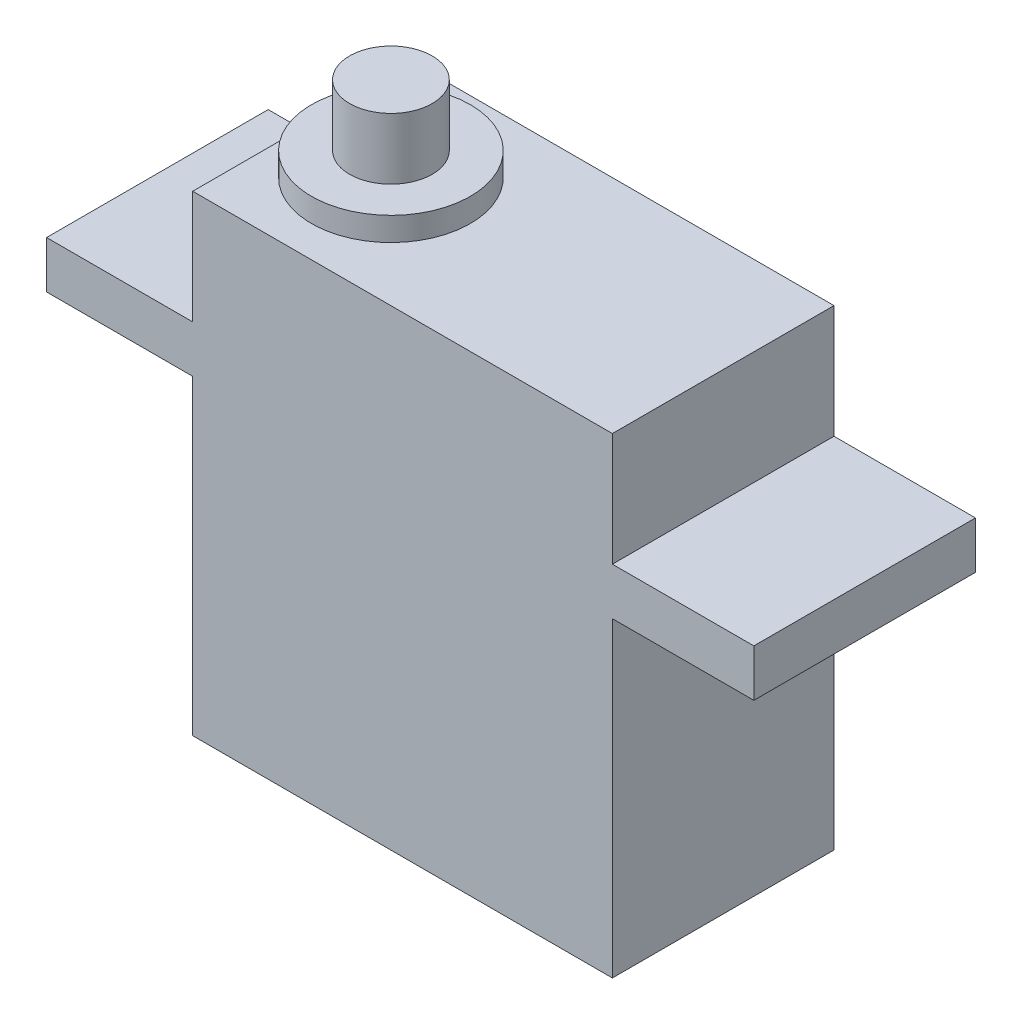
ISO-10303-21;
HEADER;
FILE_DESCRIPTION(('STEP AP214'),'2;1');
FILE_NAME('part.step','',(''),(''),'','','');
FILE_SCHEMA(('AUTOMOTIVE_DESIGN { 1 0 10303 214 1 1 1 1 }'));
ENDSEC;
DATA;
#1=APPLICATION_CONTEXT('core data for automotive mechanical design processes');
#2=APPLICATION_PROTOCOL_DEFINITION('international standard','automotive_design',2000,#1);
#3=PRODUCT_CONTEXT('',#1,'mechanical');
#4=PRODUCT('Part','Part','',(#3));
#5=PRODUCT_RELATED_PRODUCT_CATEGORY('part','',(#4));
#6=PRODUCT_DEFINITION_FORMATION('','',#4);
#7=PRODUCT_DEFINITION_CONTEXT('part definition',#1,'design');
#8=PRODUCT_DEFINITION('design','',#6,#7);
#9=PRODUCT_DEFINITION_SHAPE('','',#8);
#10=(LENGTH_UNIT() NAMED_UNIT(*) SI_UNIT(.MILLI.,.METRE.));
#11=(NAMED_UNIT(*) PLANE_ANGLE_UNIT() SI_UNIT($,.RADIAN.));
#12=(NAMED_UNIT(*) SI_UNIT($,.STERADIAN.) SOLID_ANGLE_UNIT());
#13=UNCERTAINTY_MEASURE_WITH_UNIT(LENGTH_MEASURE(1.E-05),#10,'distance_accuracy_value','');
#14=(GEOMETRIC_REPRESENTATION_CONTEXT(3) GLOBAL_UNCERTAINTY_ASSIGNED_CONTEXT((#13)) GLOBAL_UNIT_ASSIGNED_CONTEXT((#10,
#11,#12)) REPRESENTATION_CONTEXT('',''));
#15=CARTESIAN_POINT('',(0.,0.,0.));
#16=DIRECTION('',(0.,0.,1.));
#17=DIRECTION('',(1.,0.,0.));
#18=AXIS2_PLACEMENT_3D('',#15,#16,#17);
#19=CARTESIAN_POINT('',(0.,25.4,0.));
#20=DIRECTION('',(1.,0.,0.));
#21=DIRECTION('',(0.,0.,-1.));
#22=AXIS2_PLACEMENT_3D('',#19,#20,#21);
#23=PLANE('',#22);
#24=DIRECTION('',(0.,-1.,0.));
#25=VECTOR('',#24,1.);
#26=CARTESIAN_POINT('',(0.,25.4,-11.938));
#27=LINE('',#26,#25);
#28=CARTESIAN_POINT('',(0.,25.4,-11.938));
#29=VERTEX_POINT('',#28);
#30=CARTESIAN_POINT('',(0.,19.304,-11.938));
#31=VERTEX_POINT('',#30);
#32=EDGE_CURVE('E246',#29,#31,#27,.T.);
#33=ORIENTED_EDGE('',*,*,#32,.T.);
#34=DIRECTION('',(0.,0.,1.));
#35=VECTOR('',#34,1.);
#36=CARTESIAN_POINT('',(0.,19.304,0.));
#37=LINE('',#36,#35);
#38=CARTESIAN_POINT('',(0.,19.304,0.));
#39=VERTEX_POINT('',#38);
#40=EDGE_CURVE('E204',#31,#39,#37,.T.);
#41=ORIENTED_EDGE('',*,*,#40,.T.);
#42=DIRECTION('',(0.,-1.,0.));
#43=VECTOR('',#42,1.);
#44=CARTESIAN_POINT('',(0.,25.4,0.));
#45=LINE('',#44,#43);
#46=CARTESIAN_POINT('',(0.,25.4,0.));
#47=VERTEX_POINT('',#46);
#48=EDGE_CURVE('E54',#47,#39,#45,.T.);
#49=ORIENTED_EDGE('',*,*,#48,.F.);
#50=DIRECTION('',(0.,0.,1.));
#51=VECTOR('',#50,1.);
#52=CARTESIAN_POINT('',(0.,25.4,0.));
#53=LINE('',#52,#51);
#54=EDGE_CURVE('E218',#29,#47,#53,.T.);
#55=ORIENTED_EDGE('',*,*,#54,.F.);
#56=EDGE_LOOP('',(#33,#41,#49,#55));
#57=FACE_BOUND('',#56,.T.);
#58=ADVANCED_FACE('F45',(#57),#23,.F.);
#59=CARTESIAN_POINT('',(22.606,25.4,0.));
#60=DIRECTION('',(-1.,0.,0.));
#61=DIRECTION('',(0.,0.,1.));
#62=AXIS2_PLACEMENT_3D('',#59,#60,#61);
#63=PLANE('',#62);
#64=DIRECTION('',(0.,-1.,0.));
#65=VECTOR('',#64,1.);
#66=CARTESIAN_POINT('',(22.606,25.4,0.));
#67=LINE('',#66,#65);
#68=CARTESIAN_POINT('',(22.606,25.4,0.));
#69=VERTEX_POINT('',#68);
#70=CARTESIAN_POINT('',(22.606,19.304,0.));
#71=VERTEX_POINT('',#70);
#72=EDGE_CURVE('E255',#69,#71,#67,.T.);
#73=ORIENTED_EDGE('',*,*,#72,.T.);
#74=DIRECTION('',(0.,0.,-1.));
#75=VECTOR('',#74,1.);
#76=CARTESIAN_POINT('',(22.606,19.304,0.));
#77=LINE('',#76,#75);
#78=CARTESIAN_POINT('',(22.606,19.304,-11.938));
#79=VERTEX_POINT('',#78);
#80=EDGE_CURVE('E200',#71,#79,#77,.T.);
#81=ORIENTED_EDGE('',*,*,#80,.T.);
#82=DIRECTION('',(0.,-1.,0.));
#83=VECTOR('',#82,1.);
#84=CARTESIAN_POINT('',(22.606,25.4,-11.938));
#85=LINE('',#84,#83);
#86=CARTESIAN_POINT('',(22.606,25.4,-11.938));
#87=VERTEX_POINT('',#86);
#88=EDGE_CURVE('E251',#87,#79,#85,.T.);
#89=ORIENTED_EDGE('',*,*,#88,.F.);
#90=DIRECTION('',(0.,0.,-1.));
#91=VECTOR('',#90,1.);
#92=CARTESIAN_POINT('',(22.606,25.4,0.));
#93=LINE('',#92,#91);
#94=EDGE_CURVE('E226',#69,#87,#93,.T.);
#95=ORIENTED_EDGE('',*,*,#94,.F.);
#96=EDGE_LOOP('',(#73,#81,#89,#95));
#97=FACE_BOUND('',#96,.T.);
#98=ADVANCED_FACE('F298',(#97),#63,.F.);
#99=CARTESIAN_POINT('',(0.,16.764,0.));
#100=VERTEX_POINT('',#99);
#101=CARTESIAN_POINT('',(0.,0.,0.));
#102=VERTEX_POINT('',#101);
#103=EDGE_CURVE('E259',#100,#102,#45,.T.);
#104=ORIENTED_EDGE('',*,*,#103,.F.);
#105=DIRECTION('',(0.,0.,-1.));
#106=VECTOR('',#105,1.);
#107=CARTESIAN_POINT('',(0.,16.764,0.));
#108=LINE('',#107,#106);
#109=CARTESIAN_POINT('',(0.,16.764,-11.938));
#110=VERTEX_POINT('',#109);
#111=EDGE_CURVE('E197',#100,#110,#108,.T.);
#112=ORIENTED_EDGE('',*,*,#111,.T.);
#113=CARTESIAN_POINT('',(0.,0.,-11.938));
#114=VERTEX_POINT('',#113);
#115=EDGE_CURVE('E232',#110,#114,#27,.T.);
#116=ORIENTED_EDGE('',*,*,#115,.T.);
#117=DIRECTION('',(0.,0.,1.));
#118=VECTOR('',#117,1.);
#119=CARTESIAN_POINT('',(0.,0.,0.));
#120=LINE('',#119,#118);
#121=EDGE_CURVE('E217',#114,#102,#120,.T.);
#122=ORIENTED_EDGE('',*,*,#121,.T.);
#123=EDGE_LOOP('',(#104,#112,#116,#122));
#124=FACE_BOUND('',#123,.T.);
#125=ADVANCED_FACE('F47',(#124),#23,.F.);
#126=CARTESIAN_POINT('',(0.,25.4,0.));
#127=DIRECTION('',(0.,0.,-1.));
#128=DIRECTION('',(-1.,0.,0.));
#129=AXIS2_PLACEMENT_3D('',#126,#127,#128);
#130=PLANE('',#129);
#131=CARTESIAN_POINT('',(22.606,16.764,0.));
#132=VERTEX_POINT('',#131);
#133=CARTESIAN_POINT('',(22.606,0.,0.));
#134=VERTEX_POINT('',#133);
#135=EDGE_CURVE('E140',#132,#134,#67,.T.);
#136=ORIENTED_EDGE('',*,*,#135,.F.);
#137=DIRECTION('',(1.,0.,0.));
#138=VECTOR('',#137,1.);
#139=CARTESIAN_POINT('',(-7.874,16.764,0.));
#140=LINE('',#139,#138);
#141=CARTESIAN_POINT('',(30.226,16.764,0.));
#142=VERTEX_POINT('',#141);
#143=EDGE_CURVE('E61',#132,#142,#140,.T.);
#144=ORIENTED_EDGE('',*,*,#143,.T.);
#145=DIRECTION('',(0.,-1.,0.));
#146=VECTOR('',#145,1.);
#147=CARTESIAN_POINT('',(30.226,19.304,0.));
#148=LINE('',#147,#146);
#149=CARTESIAN_POINT('',(30.226,19.304,0.));
#150=VERTEX_POINT('',#149);
#151=EDGE_CURVE('E138',#150,#142,#148,.T.);
#152=ORIENTED_EDGE('',*,*,#151,.F.);
#153=DIRECTION('',(1.,0.,0.));
#154=VECTOR('',#153,1.);
#155=CARTESIAN_POINT('',(-7.874,19.304,0.));
#156=LINE('',#155,#154);
#157=EDGE_CURVE('E185',#71,#150,#156,.T.);
#158=ORIENTED_EDGE('',*,*,#157,.F.);
#159=ORIENTED_EDGE('',*,*,#72,.F.);
#160=DIRECTION('',(1.,0.,0.));
#161=VECTOR('',#160,1.);
#162=CARTESIAN_POINT('',(0.,25.4,0.));
#163=LINE('',#162,#161);
#164=EDGE_CURVE('E222',#47,#69,#163,.T.);
#165=ORIENTED_EDGE('',*,*,#164,.F.);
#166=ORIENTED_EDGE('',*,*,#48,.T.);
#167=CARTESIAN_POINT('',(-7.874,19.304,0.));
#168=VERTEX_POINT('',#167);
#169=EDGE_CURVE('E181',#168,#39,#156,.T.);
#170=ORIENTED_EDGE('',*,*,#169,.F.);
#171=DIRECTION('',(0.,-1.,0.));
#172=VECTOR('',#171,1.);
#173=CARTESIAN_POINT('',(-7.874,19.304,0.));
#174=LINE('',#173,#172);
#175=CARTESIAN_POINT('',(-7.874,16.764,0.));
#176=VERTEX_POINT('',#175);
#177=EDGE_CURVE('E167',#168,#176,#174,.T.);
#178=ORIENTED_EDGE('',*,*,#177,.T.);
#179=EDGE_CURVE('E142',#176,#100,#140,.T.);
#180=ORIENTED_EDGE('',*,*,#179,.T.);
#181=ORIENTED_EDGE('',*,*,#103,.T.);
#182=DIRECTION('',(1.,0.,0.));
#183=VECTOR('',#182,1.);
#184=CARTESIAN_POINT('',(0.,0.,0.));
#185=LINE('',#184,#183);
#186=EDGE_CURVE('E236',#102,#134,#185,.T.);
#187=ORIENTED_EDGE('',*,*,#186,.T.);
#188=EDGE_LOOP('',(#136,#144,#152,#158,#159,#165,#166,#170,#178,#180,#181,#187));
#189=FACE_BOUND('',#188,.T.);
#190=ADVANCED_FACE('F135',(#189),#130,.F.);
#191=CARTESIAN_POINT('',(22.606,16.764,-11.938));
#192=VERTEX_POINT('',#191);
#193=CARTESIAN_POINT('',(22.606,0.,-11.938));
#194=VERTEX_POINT('',#193);
#195=EDGE_CURVE('E250',#192,#194,#85,.T.);
#196=ORIENTED_EDGE('',*,*,#195,.F.);
#197=DIRECTION('',(0.,0.,1.));
#198=VECTOR('',#197,1.);
#199=CARTESIAN_POINT('',(22.606,16.764,0.));
#200=LINE('',#199,#198);
#201=EDGE_CURVE('E184',#192,#132,#200,.T.);
#202=ORIENTED_EDGE('',*,*,#201,.T.);
#203=ORIENTED_EDGE('',*,*,#135,.T.);
#204=DIRECTION('',(0.,0.,-1.));
#205=VECTOR('',#204,1.);
#206=CARTESIAN_POINT('',(22.606,0.,0.));
#207=LINE('',#206,#205);
#208=EDGE_CURVE('E239',#134,#194,#207,.T.);
#209=ORIENTED_EDGE('',*,*,#208,.T.);
#210=EDGE_LOOP('',(#196,#202,#203,#209));
#211=FACE_BOUND('',#210,.T.);
#212=ADVANCED_FACE('F321',(#211),#63,.F.);
#213=CARTESIAN_POINT('',(0.,25.4,-11.938));
#214=DIRECTION('',(0.,0.,1.));
#215=DIRECTION('',(1.,0.,0.));
#216=AXIS2_PLACEMENT_3D('',#213,#214,#215);
#217=PLANE('',#216);
#218=ORIENTED_EDGE('',*,*,#115,.F.);
#219=DIRECTION('',(1.,0.,0.));
#220=VECTOR('',#219,1.);
#221=CARTESIAN_POINT('',(-7.874,16.764,-11.938));
#222=LINE('',#221,#220);
#223=CARTESIAN_POINT('',(-7.874,16.764,-11.938));
#224=VERTEX_POINT('',#223);
#225=EDGE_CURVE('E69',#224,#110,#222,.T.);
#226=ORIENTED_EDGE('',*,*,#225,.F.);
#227=DIRECTION('',(0.,1.,0.));
#228=VECTOR('',#227,1.);
#229=CARTESIAN_POINT('',(-7.874,19.304,-11.938));
#230=LINE('',#229,#228);
#231=CARTESIAN_POINT('',(-7.874,19.304,-11.938));
#232=VERTEX_POINT('',#231);
#233=EDGE_CURVE('E174',#224,#232,#230,.T.);
#234=ORIENTED_EDGE('',*,*,#233,.T.);
#235=DIRECTION('',(1.,0.,0.));
#236=VECTOR('',#235,1.);
#237=CARTESIAN_POINT('',(-7.874,19.304,-11.938));
#238=LINE('',#237,#236);
#239=EDGE_CURVE('E186',#232,#31,#238,.T.);
#240=ORIENTED_EDGE('',*,*,#239,.T.);
#241=ORIENTED_EDGE('',*,*,#32,.F.);
#242=DIRECTION('',(-1.,0.,0.));
#243=VECTOR('',#242,1.);
#244=CARTESIAN_POINT('',(0.,25.4,-11.938));
#245=LINE('',#244,#243);
#246=EDGE_CURVE('E229',#87,#29,#245,.T.);
#247=ORIENTED_EDGE('',*,*,#246,.F.);
#248=ORIENTED_EDGE('',*,*,#88,.T.);
#249=CARTESIAN_POINT('',(30.226,19.304,-11.938));
#250=VERTEX_POINT('',#249);
#251=EDGE_CURVE('E190',#79,#250,#238,.T.);
#252=ORIENTED_EDGE('',*,*,#251,.T.);
#253=DIRECTION('',(0.,1.,0.));
#254=VECTOR('',#253,1.);
#255=CARTESIAN_POINT('',(30.226,19.304,-11.938));
#256=LINE('',#255,#254);
#257=CARTESIAN_POINT('',(30.226,16.764,-11.938));
#258=VERTEX_POINT('',#257);
#259=EDGE_CURVE('E154',#258,#250,#256,.T.);
#260=ORIENTED_EDGE('',*,*,#259,.F.);
#261=EDGE_CURVE('E149',#192,#258,#222,.T.);
#262=ORIENTED_EDGE('',*,*,#261,.F.);
#263=ORIENTED_EDGE('',*,*,#195,.T.);
#264=DIRECTION('',(-1.,0.,0.));
#265=VECTOR('',#264,1.);
#266=CARTESIAN_POINT('',(0.,0.,-11.938));
#267=LINE('',#266,#265);
#268=EDGE_CURVE('E223',#194,#114,#267,.T.);
#269=ORIENTED_EDGE('',*,*,#268,.T.);
#270=EDGE_LOOP('',(#218,#226,#234,#240,#241,#247,#248,#252,#260,#262,#263,#269));
#271=FACE_BOUND('',#270,.T.);
#272=ADVANCED_FACE('F286',(#271),#217,.F.);
#273=CARTESIAN_POINT('',(0.,25.4,0.));
#274=DIRECTION('',(0.,-1.,0.));
#275=DIRECTION('',(0.,0.,-1.));
#276=AXIS2_PLACEMENT_3D('',#273,#274,#275);
#277=PLANE('',#276);
#278=CARTESIAN_POINT('',(4.70703293865259,25.4,-5.969));
#279=DIRECTION('',(0.,-1.,0.));
#280=DIRECTION('',(0.,0.,-1.));
#281=AXIS2_PLACEMENT_3D('',#278,#279,#280);
#282=CIRCLE('',#281,4.27967995764576);
#283=CARTESIAN_POINT('',(4.70703293865259,25.4,-10.2486799576458));
#284=VERTEX_POINT('',#283);
#285=EDGE_CURVE('E11',#284,#284,#282,.F.);
#286=ORIENTED_EDGE('',*,*,#285,.F.);
#287=EDGE_LOOP('',(#286));
#288=FACE_BOUND('',#287,.T.);
#289=ORIENTED_EDGE('',*,*,#54,.T.);
#290=ORIENTED_EDGE('',*,*,#164,.T.);
#291=ORIENTED_EDGE('',*,*,#94,.T.);
#292=ORIENTED_EDGE('',*,*,#246,.T.);
#293=EDGE_LOOP('',(#289,#290,#291,#292));
#294=FACE_BOUND('',#293,.T.);
#295=ADVANCED_FACE('F283',(#288,#294),#277,.F.);
#296=CARTESIAN_POINT('',(0.,0.,0.));
#297=DIRECTION('',(0.,-1.,0.));
#298=DIRECTION('',(0.,0.,-1.));
#299=AXIS2_PLACEMENT_3D('',#296,#297,#298);
#300=PLANE('',#299);
#301=ORIENTED_EDGE('',*,*,#121,.F.);
#302=ORIENTED_EDGE('',*,*,#268,.F.);
#303=ORIENTED_EDGE('',*,*,#208,.F.);
#304=ORIENTED_EDGE('',*,*,#186,.F.);
#305=EDGE_LOOP('',(#301,#302,#303,#304));
#306=FACE_BOUND('',#305,.T.);
#307=ADVANCED_FACE('F279',(#306),#300,.T.);
#308=CARTESIAN_POINT('',(4.70703293865259,26.67,-5.969));
#309=DIRECTION('',(0.,-1.,0.));
#310=DIRECTION('',(0.,0.,-1.));
#311=AXIS2_PLACEMENT_3D('',#308,#309,#310);
#312=CYLINDRICAL_SURFACE('',#311,4.27967995764576);
#313=CARTESIAN_POINT('',(4.70703293865259,26.67,-5.969));
#314=DIRECTION('',(0.,1.,0.));
#315=DIRECTION('',(0.,0.,1.));
#316=AXIS2_PLACEMENT_3D('',#313,#314,#315);
#317=CIRCLE('',#316,4.27967995764576);
#318=CARTESIAN_POINT('',(4.70703293865259,26.67,-10.2486799576458));
#319=VERTEX_POINT('',#318);
#320=EDGE_CURVE('E208',#319,#319,#317,.T.);
#321=CARTESIAN_POINT('',(4.70703293865259,26.67,-10.2486799576458));
#322=CARTESIAN_POINT('',(4.70703293865259,26.6567708333333,-10.2486799576458));
#323=CARTESIAN_POINT('',(4.70703293865259,26.6435416666667,-10.2486799576458));
#324=CARTESIAN_POINT('',(4.70703293865259,26.6170833333333,-10.2486799576458));
#325=CARTESIAN_POINT('',(4.70703293865259,26.6038541666667,-10.2486799576458));
#326=CARTESIAN_POINT('',(4.70703293865259,26.5773958333333,-10.2486799576458));
#327=CARTESIAN_POINT('',(4.70703293865259,26.5641666666667,-10.2486799576458));
#328=CARTESIAN_POINT('',(4.70703293865259,26.5377083333333,-10.2486799576458));
#329=CARTESIAN_POINT('',(4.70703293865259,26.5244791666667,-10.2486799576458));
#330=CARTESIAN_POINT('',(4.70703293865259,26.4980208333333,-10.2486799576458));
#331=CARTESIAN_POINT('',(4.70703293865259,26.4847916666667,-10.2486799576458));
#332=CARTESIAN_POINT('',(4.70703293865259,26.4583333333333,-10.2486799576458));
#333=CARTESIAN_POINT('',(4.70703293865259,26.4451041666667,-10.2486799576458));
#334=CARTESIAN_POINT('',(4.70703293865259,26.4186458333333,-10.2486799576458));
#335=CARTESIAN_POINT('',(4.70703293865259,26.4054166666667,-10.2486799576458));
#336=CARTESIAN_POINT('',(4.70703293865259,26.3789583333333,-10.2486799576458));
#337=CARTESIAN_POINT('',(4.70703293865259,26.3657291666667,-10.2486799576458));
#338=CARTESIAN_POINT('',(4.70703293865259,26.3392708333333,-10.2486799576458));
#339=CARTESIAN_POINT('',(4.70703293865259,26.3260416666667,-10.2486799576458));
#340=CARTESIAN_POINT('',(4.70703293865259,26.2995833333333,-10.2486799576458));
#341=CARTESIAN_POINT('',(4.70703293865259,26.2863541666667,-10.2486799576458));
#342=CARTESIAN_POINT('',(4.70703293865259,26.2598958333333,-10.2486799576458));
#343=CARTESIAN_POINT('',(4.70703293865259,26.2466666666667,-10.2486799576458));
#344=CARTESIAN_POINT('',(4.70703293865259,26.2202083333333,-10.2486799576458));
#345=CARTESIAN_POINT('',(4.70703293865259,26.2069791666667,-10.2486799576458));
#346=CARTESIAN_POINT('',(4.70703293865259,26.1805208333333,-10.2486799576458));
#347=CARTESIAN_POINT('',(4.70703293865259,26.1672916666667,-10.2486799576458));
#348=CARTESIAN_POINT('',(4.70703293865259,26.1408333333333,-10.2486799576458));
#349=CARTESIAN_POINT('',(4.70703293865259,26.1276041666667,-10.2486799576458));
#350=CARTESIAN_POINT('',(4.70703293865259,26.1011458333333,-10.2486799576458));
#351=CARTESIAN_POINT('',(4.70703293865259,26.0879166666667,-10.2486799576458));
#352=CARTESIAN_POINT('',(4.70703293865259,26.0614583333333,-10.2486799576458));
#353=CARTESIAN_POINT('',(4.70703293865259,26.0482291666667,-10.2486799576458));
#354=CARTESIAN_POINT('',(4.70703293865259,26.0217708333333,-10.2486799576458));
#355=CARTESIAN_POINT('',(4.70703293865259,26.0085416666667,-10.2486799576458));
#356=CARTESIAN_POINT('',(4.70703293865259,25.9820833333333,-10.2486799576458));
#357=CARTESIAN_POINT('',(4.70703293865259,25.9688541666667,-10.2486799576458));
#358=CARTESIAN_POINT('',(4.70703293865259,25.9423958333333,-10.2486799576458));
#359=CARTESIAN_POINT('',(4.70703293865259,25.9291666666667,-10.2486799576458));
#360=CARTESIAN_POINT('',(4.70703293865259,25.9027083333333,-10.2486799576458));
#361=CARTESIAN_POINT('',(4.70703293865259,25.8894791666667,-10.2486799576458));
#362=CARTESIAN_POINT('',(4.70703293865259,25.8630208333333,-10.2486799576458));
#363=CARTESIAN_POINT('',(4.70703293865259,25.8497916666667,-10.2486799576458));
#364=CARTESIAN_POINT('',(4.70703293865259,25.8233333333333,-10.2486799576458));
#365=CARTESIAN_POINT('',(4.70703293865259,25.8101041666667,-10.2486799576458));
#366=CARTESIAN_POINT('',(4.70703293865259,25.7836458333333,-10.2486799576458));
#367=CARTESIAN_POINT('',(4.70703293865259,25.7704166666667,-10.2486799576458));
#368=CARTESIAN_POINT('',(4.70703293865259,25.7439583333333,-10.2486799576458));
#369=CARTESIAN_POINT('',(4.70703293865259,25.7307291666667,-10.2486799576458));
#370=CARTESIAN_POINT('',(4.70703293865259,25.7042708333333,-10.2486799576458));
#371=CARTESIAN_POINT('',(4.70703293865259,25.6910416666667,-10.2486799576458));
#372=CARTESIAN_POINT('',(4.70703293865259,25.6645833333333,-10.2486799576458));
#373=CARTESIAN_POINT('',(4.70703293865259,25.6513541666667,-10.2486799576458));
#374=CARTESIAN_POINT('',(4.70703293865259,25.6248958333333,-10.2486799576458));
#375=CARTESIAN_POINT('',(4.70703293865259,25.6116666666667,-10.2486799576458));
#376=CARTESIAN_POINT('',(4.70703293865259,25.5852083333333,-10.2486799576458));
#377=CARTESIAN_POINT('',(4.70703293865259,25.5719791666667,-10.2486799576458));
#378=CARTESIAN_POINT('',(4.70703293865259,25.5455208333333,-10.2486799576458));
#379=CARTESIAN_POINT('',(4.70703293865259,25.5322916666667,-10.2486799576458));
#380=CARTESIAN_POINT('',(4.70703293865259,25.5058333333333,-10.2486799576458));
#381=CARTESIAN_POINT('',(4.70703293865259,25.4926041666667,-10.2486799576458));
#382=CARTESIAN_POINT('',(4.70703293865259,25.4661458333333,-10.2486799576458));
#383=CARTESIAN_POINT('',(4.70703293865259,25.4529166666667,-10.2486799576458));
#384=CARTESIAN_POINT('',(4.70703293865259,25.4264583333333,-10.2486799576458));
#385=CARTESIAN_POINT('',(4.70703293865259,25.4132291666667,-10.2486799576458));
#386=CARTESIAN_POINT('',(4.70703293865259,25.4,-10.2486799576458));
#387=B_SPLINE_CURVE_WITH_KNOTS('',3,(#321,#322,#323,#324,#325,#326,#327,#328,#329,#330,#331,
#332,#333,#334,#335,#336,#337,#338,#339,#340,#341,#342,#343,#344,#345,#346,#347,#348,#349,#350,
#351,#352,#353,#354,#355,#356,#357,#358,#359,#360,#361,#362,#363,#364,#365,#366,#367,#368,#369,
#370,#371,#372,#373,#374,#375,#376,#377,#378,#379,#380,#381,#382,#383,#384,#385,#386),
.UNSPECIFIED.,.F.,.F.,(4,2,2,2,2,2,2,2,2,2,2,2,2,2,2,2,2,2,2,2,2,2,2,2,2,2,2,2,2,2,2,2,4),(0.,
0.0396874999999998,0.0793749999999996,0.119062499999999,0.158749999999999,0.198437499999999,
0.238124999999999,0.277812499999999,0.317499999999998,0.357187499999998,0.396874999999998,
0.436562499999998,0.476249999999998,0.515937499999997,0.555624999999997,0.595312499999997,
0.634999999999997,0.674687499999996,0.714374999999996,0.754062499999996,0.793749999999996,
0.833437499999996,0.873124999999995,0.912812499999995,0.952499999999995,0.992187499999995,
1.03187499999999,1.07156249999999,1.11124999999999,1.15093749999999,1.19062499999999,
1.23031249999999,1.26999999999999),.UNSPECIFIED.);
#388=EDGE_CURVE('BSEAM273',#319,#284,#387,.T.);
#389=ORIENTED_EDGE('',*,*,#320,.F.);
#390=ORIENTED_EDGE('',*,*,#285,.T.);
#391=ORIENTED_EDGE('',*,*,#388,.T.);
#392=ORIENTED_EDGE('',*,*,#388,.F.);
#393=EDGE_LOOP('',(#389,#391,#390,#392));
#394=FACE_BOUND('',#393,.T.);
#395=ADVANCED_FACE('F273',(#394),#312,.T.);
#396=CARTESIAN_POINT('',(4.70703293865259,26.67,-5.969));
#397=DIRECTION('',(0.,1.,0.));
#398=DIRECTION('',(0.,0.,1.));
#399=AXIS2_PLACEMENT_3D('',#396,#397,#398);
#400=PLANE('',#399);
#401=CARTESIAN_POINT('',(4.70703293865259,26.67,-5.969));
#402=DIRECTION('',(0.,1.,0.));
#403=DIRECTION('',(0.,0.,1.));
#404=AXIS2_PLACEMENT_3D('',#401,#402,#403);
#405=CIRCLE('',#404,2.22467220242239);
#406=CARTESIAN_POINT('',(4.70703293865259,26.67,-3.74432779757761));
#407=VERTEX_POINT('',#406);
#408=EDGE_CURVE('E212',#407,#407,#405,.T.);
#409=ORIENTED_EDGE('',*,*,#408,.F.);
#410=EDGE_LOOP('',(#409));
#411=FACE_BOUND('',#410,.T.);
#412=ORIENTED_EDGE('',*,*,#320,.T.);
#413=EDGE_LOOP('',(#412));
#414=FACE_BOUND('',#413,.T.);
#415=ADVANCED_FACE('F269',(#411,#414),#400,.T.);
#416=CARTESIAN_POINT('',(4.70703293865259,29.972,-5.969));
#417=DIRECTION('',(0.,1.,0.));
#418=DIRECTION('',(0.,0.,1.));
#419=AXIS2_PLACEMENT_3D('',#416,#417,#418);
#420=PLANE('',#419);
#421=CARTESIAN_POINT('',(4.70703293865259,29.972,-5.969));
#422=DIRECTION('',(0.,1.,0.));
#423=DIRECTION('',(0.,0.,1.));
#424=AXIS2_PLACEMENT_3D('',#421,#422,#423);
#425=CIRCLE('',#424,2.22467220242239);
#426=CARTESIAN_POINT('',(4.70703293865259,29.972,-3.74432779757761));
#427=VERTEX_POINT('',#426);
#428=EDGE_CURVE('E213',#427,#427,#425,.T.);
#429=ORIENTED_EDGE('',*,*,#428,.T.);
#430=EDGE_LOOP('',(#429));
#431=FACE_BOUND('',#430,.T.);
#432=ADVANCED_FACE('F272',(#431),#420,.T.);
#433=CARTESIAN_POINT('',(4.70703293865259,29.972,-5.969));
#434=DIRECTION('',(0.,-1.,0.));
#435=DIRECTION('',(0.,0.,-1.));
#436=AXIS2_PLACEMENT_3D('',#433,#434,#435);
#437=CYLINDRICAL_SURFACE('',#436,2.22467220242239);
#438=ORIENTED_EDGE('',*,*,#408,.T.);
#439=EDGE_LOOP('',(#438));
#440=FACE_BOUND('',#439,.T.);
#441=ORIENTED_EDGE('',*,*,#428,.F.);
#442=EDGE_LOOP('',(#441));
#443=FACE_BOUND('',#442,.T.);
#444=ADVANCED_FACE('F266',(#440,#443),#437,.T.);
#445=CARTESIAN_POINT('',(30.226,0.,0.));
#446=DIRECTION('',(1.,0.,0.));
#447=DIRECTION('',(0.,0.,-1.));
#448=AXIS2_PLACEMENT_3D('',#445,#446,#447);
#449=PLANE('',#448);
#450=ORIENTED_EDGE('',*,*,#151,.T.);
#451=DIRECTION('',(0.,0.,-1.));
#452=VECTOR('',#451,1.);
#453=CARTESIAN_POINT('',(30.226,16.764,0.));
#454=LINE('',#453,#452);
#455=EDGE_CURVE('E146',#142,#258,#454,.T.);
#456=ORIENTED_EDGE('',*,*,#455,.T.);
#457=ORIENTED_EDGE('',*,*,#259,.T.);
#458=DIRECTION('',(0.,0.,1.));
#459=VECTOR('',#458,1.);
#460=CARTESIAN_POINT('',(30.226,19.304,0.));
#461=LINE('',#460,#459);
#462=EDGE_CURVE('E159',#250,#150,#461,.T.);
#463=ORIENTED_EDGE('',*,*,#462,.T.);
#464=EDGE_LOOP('',(#450,#456,#457,#463));
#465=FACE_BOUND('',#464,.T.);
#466=ADVANCED_FACE('F157',(#465),#449,.T.);
#467=CARTESIAN_POINT('',(-7.874,16.764,0.));
#468=DIRECTION('',(0.,-1.,0.));
#469=DIRECTION('',(0.,0.,-1.));
#470=AXIS2_PLACEMENT_3D('',#467,#468,#469);
#471=PLANE('',#470);
#472=ORIENTED_EDGE('',*,*,#201,.F.);
#473=ORIENTED_EDGE('',*,*,#261,.T.);
#474=ORIENTED_EDGE('',*,*,#455,.F.);
#475=ORIENTED_EDGE('',*,*,#143,.F.);
#476=EDGE_LOOP('',(#472,#473,#474,#475));
#477=FACE_BOUND('',#476,.T.);
#478=ADVANCED_FACE('F147',(#477),#471,.T.);
#479=CARTESIAN_POINT('',(-7.874,19.304,0.));
#480=DIRECTION('',(0.,1.,0.));
#481=DIRECTION('',(0.,0.,1.));
#482=AXIS2_PLACEMENT_3D('',#479,#480,#481);
#483=PLANE('',#482);
#484=ORIENTED_EDGE('',*,*,#80,.F.);
#485=ORIENTED_EDGE('',*,*,#157,.T.);
#486=ORIENTED_EDGE('',*,*,#462,.F.);
#487=ORIENTED_EDGE('',*,*,#251,.F.);
#488=EDGE_LOOP('',(#484,#485,#486,#487));
#489=FACE_BOUND('',#488,.T.);
#490=ADVANCED_FACE('F326',(#489),#483,.T.);
#491=ORIENTED_EDGE('',*,*,#40,.F.);
#492=ORIENTED_EDGE('',*,*,#239,.F.);
#493=DIRECTION('',(0.,0.,1.));
#494=VECTOR('',#493,1.);
#495=CARTESIAN_POINT('',(-7.874,19.304,0.));
#496=LINE('',#495,#494);
#497=EDGE_CURVE('E143',#232,#168,#496,.T.);
#498=ORIENTED_EDGE('',*,*,#497,.T.);
#499=ORIENTED_EDGE('',*,*,#169,.T.);
#500=EDGE_LOOP('',(#491,#492,#498,#499));
#501=FACE_BOUND('',#500,.T.);
#502=ADVANCED_FACE('F304',(#501),#483,.T.);
#503=ORIENTED_EDGE('',*,*,#111,.F.);
#504=ORIENTED_EDGE('',*,*,#179,.F.);
#505=DIRECTION('',(0.,0.,-1.));
#506=VECTOR('',#505,1.);
#507=CARTESIAN_POINT('',(-7.874,16.764,0.));
#508=LINE('',#507,#506);
#509=EDGE_CURVE('E171',#176,#224,#508,.T.);
#510=ORIENTED_EDGE('',*,*,#509,.T.);
#511=ORIENTED_EDGE('',*,*,#225,.T.);
#512=EDGE_LOOP('',(#503,#504,#510,#511));
#513=FACE_BOUND('',#512,.T.);
#514=ADVANCED_FACE('F333',(#513),#471,.T.);
#515=CARTESIAN_POINT('',(-7.874,0.,0.));
#516=DIRECTION('',(1.,0.,0.));
#517=DIRECTION('',(0.,0.,-1.));
#518=AXIS2_PLACEMENT_3D('',#515,#516,#517);
#519=PLANE('',#518);
#520=ORIENTED_EDGE('',*,*,#177,.F.);
#521=ORIENTED_EDGE('',*,*,#497,.F.);
#522=ORIENTED_EDGE('',*,*,#233,.F.);
#523=ORIENTED_EDGE('',*,*,#509,.F.);
#524=EDGE_LOOP('',(#520,#521,#522,#523));
#525=FACE_BOUND('',#524,.T.);
#526=ADVANCED_FACE('F306',(#525),#519,.F.);
#527=CLOSED_SHELL('',(#58,#98,#125,#190,#212,#272,#295,#307,#395,#415,#432,#444,#466,#478,#490,
#502,#514,#526));
#528=MANIFOLD_SOLID_BREP('B2',#527);
#529=ADVANCED_BREP_SHAPE_REPRESENTATION('',(#18,#528),#14);
#530=SHAPE_DEFINITION_REPRESENTATION(#9,#529);
ENDSEC;
END-ISO-10303-21;
